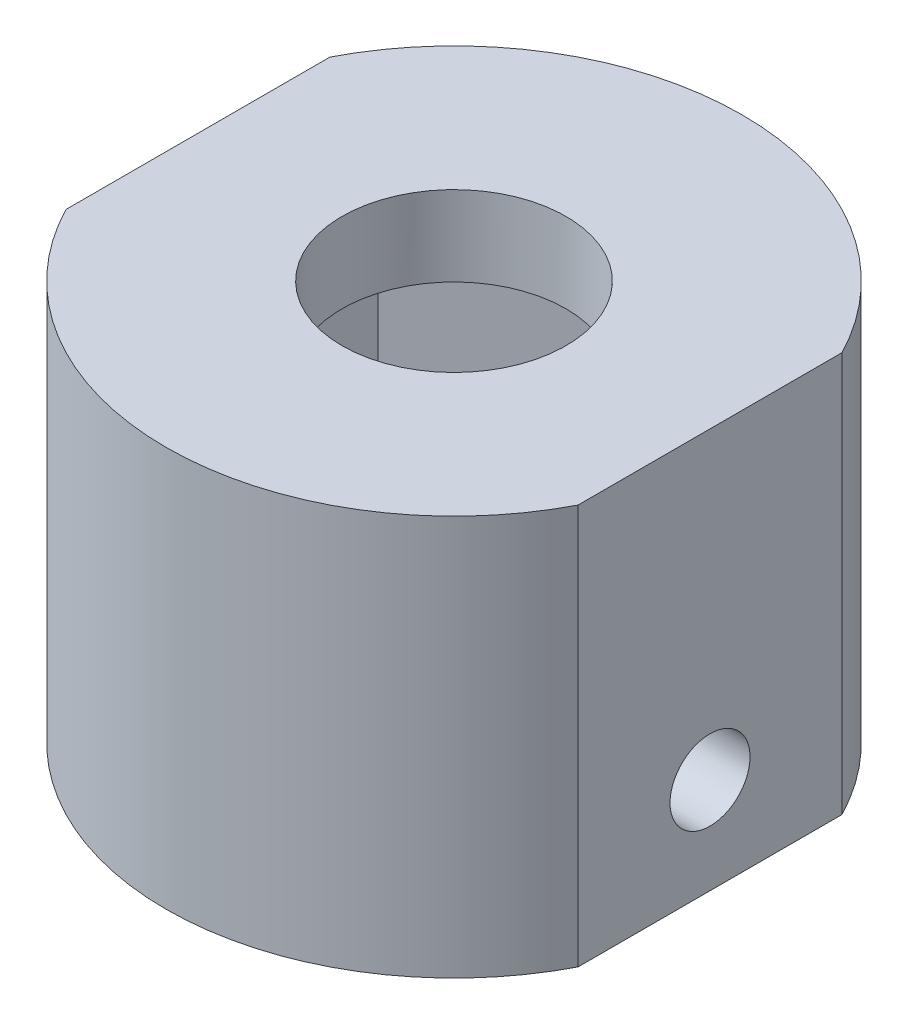
ISO-10303-21;
HEADER;
FILE_DESCRIPTION(('STEP AP214'),'2;1');
FILE_NAME('part.step','',(''),(''),'','','');
FILE_SCHEMA(('AUTOMOTIVE_DESIGN { 1 0 10303 214 1 1 1 1 }'));
ENDSEC;
DATA;
#1=APPLICATION_CONTEXT('core data for automotive mechanical design processes');
#2=APPLICATION_PROTOCOL_DEFINITION('international standard','automotive_design',2000,#1);
#3=PRODUCT_CONTEXT('',#1,'mechanical');
#4=PRODUCT('Part','Part','',(#3));
#5=PRODUCT_RELATED_PRODUCT_CATEGORY('part','',(#4));
#6=PRODUCT_DEFINITION_FORMATION('','',#4);
#7=PRODUCT_DEFINITION_CONTEXT('part definition',#1,'design');
#8=PRODUCT_DEFINITION('design','',#6,#7);
#9=PRODUCT_DEFINITION_SHAPE('','',#8);
#10=(LENGTH_UNIT() NAMED_UNIT(*) SI_UNIT(.MILLI.,.METRE.));
#11=(NAMED_UNIT(*) PLANE_ANGLE_UNIT() SI_UNIT($,.RADIAN.));
#12=(NAMED_UNIT(*) SI_UNIT($,.STERADIAN.) SOLID_ANGLE_UNIT());
#13=UNCERTAINTY_MEASURE_WITH_UNIT(LENGTH_MEASURE(1.E-05),#10,'distance_accuracy_value','');
#14=(GEOMETRIC_REPRESENTATION_CONTEXT(3) GLOBAL_UNCERTAINTY_ASSIGNED_CONTEXT((#13)) GLOBAL_UNIT_ASSIGNED_CONTEXT((#10,
#11,#12)) REPRESENTATION_CONTEXT('',''));
#15=CARTESIAN_POINT('',(0.,0.,0.));
#16=DIRECTION('',(0.,0.,1.));
#17=DIRECTION('',(1.,0.,0.));
#18=AXIS2_PLACEMENT_3D('',#15,#16,#17);
#19=CARTESIAN_POINT('',(0.,12.5,0.));
#20=DIRECTION('',(0.,-1.,0.));
#21=DIRECTION('',(0.,0.,-1.));
#22=AXIS2_PLACEMENT_3D('',#19,#20,#21);
#23=CYLINDRICAL_SURFACE('',#22,9.);
#24=CARTESIAN_POINT('',(0.,12.5,0.));
#25=DIRECTION('',(0.,1.,0.));
#26=DIRECTION('',(0.,0.,1.));
#27=AXIS2_PLACEMENT_3D('',#24,#25,#26);
#28=CIRCLE('',#27,9.);
#29=CARTESIAN_POINT('',(-8.,12.5,4.12310562561766));
#30=VERTEX_POINT('',#29);
#31=CARTESIAN_POINT('',(8.,12.5,4.12310562561766));
#32=VERTEX_POINT('',#31);
#33=EDGE_CURVE('E52',#30,#32,#28,.T.);
#34=ORIENTED_EDGE('',*,*,#33,.F.);
#35=DIRECTION('',(0.,-1.,0.));
#36=VECTOR('',#35,1.);
#37=CARTESIAN_POINT('',(-8.,12.5,4.12310562561766));
#38=LINE('',#37,#36);
#39=CARTESIAN_POINT('',(-8.,0.,4.12310562561766));
#40=VERTEX_POINT('',#39);
#41=EDGE_CURVE('E124',#30,#40,#38,.T.);
#42=ORIENTED_EDGE('',*,*,#41,.T.);
#43=CARTESIAN_POINT('',(0.,0.,0.));
#44=DIRECTION('',(0.,1.,0.));
#45=DIRECTION('',(0.,0.,1.));
#46=AXIS2_PLACEMENT_3D('',#43,#44,#45);
#47=CIRCLE('',#46,9.);
#48=CARTESIAN_POINT('',(8.,0.,4.12310562561766));
#49=VERTEX_POINT('',#48);
#50=EDGE_CURVE('E228',#40,#49,#47,.T.);
#51=ORIENTED_EDGE('',*,*,#50,.T.);
#52=DIRECTION('',(0.,-1.,0.));
#53=VECTOR('',#52,1.);
#54=CARTESIAN_POINT('',(8.,12.5,4.12310562561766));
#55=LINE('',#54,#53);
#56=EDGE_CURVE('E68',#32,#49,#55,.T.);
#57=ORIENTED_EDGE('',*,*,#56,.F.);
#58=EDGE_LOOP('',(#34,#42,#51,#57));
#59=FACE_BOUND('',#58,.T.);
#60=ADVANCED_FACE('F42',(#59),#23,.T.);
#61=CARTESIAN_POINT('',(0.,0.,0.));
#62=DIRECTION('',(0.,1.,0.));
#63=DIRECTION('',(0.,0.,1.));
#64=AXIS2_PLACEMENT_3D('',#61,#62,#63);
#65=CYLINDRICAL_SURFACE('',#64,3.5);
#66=CARTESIAN_POINT('',(0.,12.5,0.));
#67=DIRECTION('',(0.,1.,0.));
#68=DIRECTION('',(0.,0.,1.));
#69=AXIS2_PLACEMENT_3D('',#66,#67,#68);
#70=CIRCLE('',#69,3.5);
#71=CARTESIAN_POINT('',(0.,12.5,3.5));
#72=VERTEX_POINT('',#71);
#73=EDGE_CURVE('E225',#72,#72,#70,.T.);
#74=ORIENTED_EDGE('',*,*,#73,.T.);
#75=EDGE_LOOP('',(#74));
#76=FACE_BOUND('',#75,.T.);
#77=CARTESIAN_POINT('',(0.,10.,0.));
#78=DIRECTION('',(0.,-1.,0.));
#79=DIRECTION('',(0.,0.,-1.));
#80=AXIS2_PLACEMENT_3D('',#77,#78,#79);
#81=CIRCLE('',#80,3.5);
#82=CARTESIAN_POINT('',(0.,10.,-3.5));
#83=VERTEX_POINT('',#82);
#84=EDGE_CURVE('E209',#83,#83,#81,.F.);
#85=ORIENTED_EDGE('',*,*,#84,.F.);
#86=EDGE_LOOP('',(#85));
#87=FACE_BOUND('',#86,.T.);
#88=ADVANCED_FACE('F257',(#76,#87),#65,.F.);
#89=CARTESIAN_POINT('',(8.,0.,-4.12310562561766));
#90=VERTEX_POINT('',#89);
#91=CARTESIAN_POINT('',(-8.,0.,-4.12310562561766));
#92=VERTEX_POINT('',#91);
#93=EDGE_CURVE('E136',#90,#92,#47,.T.);
#94=ORIENTED_EDGE('',*,*,#93,.T.);
#95=DIRECTION('',(0.,-1.,0.));
#96=VECTOR('',#95,1.);
#97=CARTESIAN_POINT('',(-8.,12.5,-4.12310562561766));
#98=LINE('',#97,#96);
#99=CARTESIAN_POINT('',(-8.,12.5,-4.12310562561766));
#100=VERTEX_POINT('',#99);
#101=EDGE_CURVE('E60',#100,#92,#98,.T.);
#102=ORIENTED_EDGE('',*,*,#101,.F.);
#103=CARTESIAN_POINT('',(8.,12.5,-4.12310562561766));
#104=VERTEX_POINT('',#103);
#105=EDGE_CURVE('E11',#104,#100,#28,.T.);
#106=ORIENTED_EDGE('',*,*,#105,.F.);
#107=DIRECTION('',(0.,-1.,0.));
#108=VECTOR('',#107,1.);
#109=CARTESIAN_POINT('',(8.,12.5,-4.12310562561766));
#110=LINE('',#109,#108);
#111=EDGE_CURVE('E149',#104,#90,#110,.T.);
#112=ORIENTED_EDGE('',*,*,#111,.T.);
#113=EDGE_LOOP('',(#94,#102,#106,#112));
#114=FACE_BOUND('',#113,.T.);
#115=ADVANCED_FACE('F44',(#114),#23,.T.);
#116=CARTESIAN_POINT('',(0.,12.5,0.));
#117=DIRECTION('',(0.,1.,0.));
#118=DIRECTION('',(0.,0.,1.));
#119=AXIS2_PLACEMENT_3D('',#116,#117,#118);
#120=PLANE('',#119);
#121=DIRECTION('',(0.,0.,1.));
#122=VECTOR('',#121,1.);
#123=CARTESIAN_POINT('',(-8.,12.5,4.12310562561766));
#124=LINE('',#123,#122);
#125=EDGE_CURVE('E120',#100,#30,#124,.T.);
#126=ORIENTED_EDGE('',*,*,#125,.T.);
#127=ORIENTED_EDGE('',*,*,#33,.T.);
#128=DIRECTION('',(0.,0.,-1.));
#129=VECTOR('',#128,1.);
#130=CARTESIAN_POINT('',(8.,12.5,4.12310562561766));
#131=LINE('',#130,#129);
#132=EDGE_CURVE('E142',#32,#104,#131,.T.);
#133=ORIENTED_EDGE('',*,*,#132,.T.);
#134=ORIENTED_EDGE('',*,*,#105,.T.);
#135=EDGE_LOOP('',(#126,#127,#133,#134));
#136=FACE_BOUND('',#135,.T.);
#137=ORIENTED_EDGE('',*,*,#73,.F.);
#138=EDGE_LOOP('',(#137));
#139=FACE_BOUND('',#138,.T.);
#140=ADVANCED_FACE('F140',(#136,#139),#120,.T.);
#141=CARTESIAN_POINT('',(0.,0.,0.));
#142=DIRECTION('',(0.,1.,0.));
#143=DIRECTION('',(0.,0.,1.));
#144=AXIS2_PLACEMENT_3D('',#141,#142,#143);
#145=PLANE('',#144);
#146=DIRECTION('',(-0.866025403784439,0.,-0.5));
#147=VECTOR('',#146,1.);
#148=CARTESIAN_POINT('',(0.,0.,6.49519052838329));
#149=LINE('',#148,#147);
#150=CARTESIAN_POINT('',(0.,0.,6.49519052838329));
#151=VERTEX_POINT('',#150);
#152=CARTESIAN_POINT('',(-5.625,0.,3.24759526419164));
#153=VERTEX_POINT('',#152);
#154=EDGE_CURVE('E187',#151,#153,#149,.T.);
#155=ORIENTED_EDGE('',*,*,#154,.F.);
#156=DIRECTION('',(-0.866025403784439,0.,0.5));
#157=VECTOR('',#156,1.);
#158=CARTESIAN_POINT('',(5.625,0.,3.24759526419165));
#159=LINE('',#158,#157);
#160=CARTESIAN_POINT('',(5.625,0.,3.24759526419165));
#161=VERTEX_POINT('',#160);
#162=EDGE_CURVE('E157',#161,#151,#159,.T.);
#163=ORIENTED_EDGE('',*,*,#162,.F.);
#164=DIRECTION('',(0.,0.,1.));
#165=VECTOR('',#164,1.);
#166=CARTESIAN_POINT('',(5.625,0.,-3.24759526419164));
#167=LINE('',#166,#165);
#168=CARTESIAN_POINT('',(5.625,0.,-3.24759526419164));
#169=VERTEX_POINT('',#168);
#170=EDGE_CURVE('E164',#169,#161,#167,.T.);
#171=ORIENTED_EDGE('',*,*,#170,.F.);
#172=DIRECTION('',(0.866025403784439,0.,0.5));
#173=VECTOR('',#172,1.);
#174=CARTESIAN_POINT('',(0.,0.,-6.49519052838329));
#175=LINE('',#174,#173);
#176=CARTESIAN_POINT('',(0.,0.,-6.49519052838329));
#177=VERTEX_POINT('',#176);
#178=EDGE_CURVE('E199',#177,#169,#175,.T.);
#179=ORIENTED_EDGE('',*,*,#178,.F.);
#180=DIRECTION('',(0.866025403784439,0.,-0.5));
#181=VECTOR('',#180,1.);
#182=CARTESIAN_POINT('',(-5.625,0.,-3.24759526419165));
#183=LINE('',#182,#181);
#184=CARTESIAN_POINT('',(-5.625,0.,-3.24759526419165));
#185=VERTEX_POINT('',#184);
#186=EDGE_CURVE('E195',#185,#177,#183,.T.);
#187=ORIENTED_EDGE('',*,*,#186,.F.);
#188=DIRECTION('',(0.,0.,-1.));
#189=VECTOR('',#188,1.);
#190=CARTESIAN_POINT('',(-5.625,0.,3.24759526419164));
#191=LINE('',#190,#189);
#192=EDGE_CURVE('E191',#153,#185,#191,.T.);
#193=ORIENTED_EDGE('',*,*,#192,.F.);
#194=EDGE_LOOP('',(#155,#163,#171,#179,#187,#193));
#195=FACE_BOUND('',#194,.T.);
#196=ORIENTED_EDGE('',*,*,#50,.F.);
#197=DIRECTION('',(0.,0.,1.));
#198=VECTOR('',#197,1.);
#199=CARTESIAN_POINT('',(-8.,0.,4.12310562561766));
#200=LINE('',#199,#198);
#201=EDGE_CURVE('E129',#92,#40,#200,.T.);
#202=ORIENTED_EDGE('',*,*,#201,.F.);
#203=ORIENTED_EDGE('',*,*,#93,.F.);
#204=DIRECTION('',(0.,0.,-1.));
#205=VECTOR('',#204,1.);
#206=CARTESIAN_POINT('',(8.,0.,4.12310562561766));
#207=LINE('',#206,#205);
#208=EDGE_CURVE('E144',#49,#90,#207,.T.);
#209=ORIENTED_EDGE('',*,*,#208,.F.);
#210=EDGE_LOOP('',(#196,#202,#203,#209));
#211=FACE_BOUND('',#210,.T.);
#212=ADVANCED_FACE('F253',(#195,#211),#145,.F.);
#213=CARTESIAN_POINT('',(0.,10.,0.));
#214=DIRECTION('',(0.,-1.,0.));
#215=DIRECTION('',(0.,0.,-1.));
#216=AXIS2_PLACEMENT_3D('',#213,#214,#215);
#217=PLANE('',#216);
#218=DIRECTION('',(-0.866025403784439,0.,0.5));
#219=VECTOR('',#218,1.);
#220=CARTESIAN_POINT('',(5.625,10.,3.24759526419165));
#221=LINE('',#220,#219);
#222=CARTESIAN_POINT('',(5.625,10.,3.24759526419165));
#223=VERTEX_POINT('',#222);
#224=CARTESIAN_POINT('',(0.,10.,6.49519052838329));
#225=VERTEX_POINT('',#224);
#226=EDGE_CURVE('E159',#223,#225,#221,.T.);
#227=ORIENTED_EDGE('',*,*,#226,.T.);
#228=DIRECTION('',(-0.866025403784439,0.,-0.5));
#229=VECTOR('',#228,1.);
#230=CARTESIAN_POINT('',(0.,10.,6.49519052838329));
#231=LINE('',#230,#229);
#232=CARTESIAN_POINT('',(-5.625,10.,3.24759526419164));
#233=VERTEX_POINT('',#232);
#234=EDGE_CURVE('E163',#225,#233,#231,.T.);
#235=ORIENTED_EDGE('',*,*,#234,.T.);
#236=DIRECTION('',(0.,0.,-1.));
#237=VECTOR('',#236,1.);
#238=CARTESIAN_POINT('',(-5.625,10.,3.24759526419164));
#239=LINE('',#238,#237);
#240=CARTESIAN_POINT('',(-5.625,10.,-3.24759526419165));
#241=VERTEX_POINT('',#240);
#242=EDGE_CURVE('E168',#233,#241,#239,.T.);
#243=ORIENTED_EDGE('',*,*,#242,.T.);
#244=DIRECTION('',(0.866025403784439,0.,-0.5));
#245=VECTOR('',#244,1.);
#246=CARTESIAN_POINT('',(-5.625,10.,-3.24759526419165));
#247=LINE('',#246,#245);
#248=CARTESIAN_POINT('',(0.,10.,-6.49519052838329));
#249=VERTEX_POINT('',#248);
#250=EDGE_CURVE('E172',#241,#249,#247,.T.);
#251=ORIENTED_EDGE('',*,*,#250,.T.);
#252=DIRECTION('',(0.866025403784439,0.,0.5));
#253=VECTOR('',#252,1.);
#254=CARTESIAN_POINT('',(0.,10.,-6.49519052838329));
#255=LINE('',#254,#253);
#256=CARTESIAN_POINT('',(5.625,10.,-3.24759526419164));
#257=VERTEX_POINT('',#256);
#258=EDGE_CURVE('E176',#249,#257,#255,.T.);
#259=ORIENTED_EDGE('',*,*,#258,.T.);
#260=DIRECTION('',(0.,0.,1.));
#261=VECTOR('',#260,1.);
#262=CARTESIAN_POINT('',(5.625,10.,-3.24759526419164));
#263=LINE('',#262,#261);
#264=EDGE_CURVE('E180',#257,#223,#263,.T.);
#265=ORIENTED_EDGE('',*,*,#264,.T.);
#266=EDGE_LOOP('',(#227,#235,#243,#251,#259,#265));
#267=FACE_BOUND('',#266,.T.);
#268=ORIENTED_EDGE('',*,*,#84,.T.);
#269=EDGE_LOOP('',(#268));
#270=FACE_BOUND('',#269,.T.);
#271=ADVANCED_FACE('F272',(#267,#270),#217,.T.);
#272=CARTESIAN_POINT('',(5.625,10.,3.24759526419165));
#273=DIRECTION('',(0.5,0.,0.866025403784439));
#274=DIRECTION('',(0.866025403784439,0.,-0.5));
#275=AXIS2_PLACEMENT_3D('',#272,#273,#274);
#276=PLANE('',#275);
#277=ORIENTED_EDGE('',*,*,#162,.T.);
#278=DIRECTION('',(0.,-1.,0.));
#279=VECTOR('',#278,1.);
#280=CARTESIAN_POINT('',(0.,10.,6.49519052838329));
#281=LINE('',#280,#279);
#282=EDGE_CURVE('E184',#225,#151,#281,.T.);
#283=ORIENTED_EDGE('',*,*,#282,.F.);
#284=ORIENTED_EDGE('',*,*,#226,.F.);
#285=DIRECTION('',(0.,-1.,0.));
#286=VECTOR('',#285,1.);
#287=CARTESIAN_POINT('',(5.625,10.,3.24759526419165));
#288=LINE('',#287,#286);
#289=EDGE_CURVE('E206',#223,#161,#288,.T.);
#290=ORIENTED_EDGE('',*,*,#289,.T.);
#291=EDGE_LOOP('',(#277,#283,#284,#290));
#292=FACE_BOUND('',#291,.T.);
#293=ADVANCED_FACE('F275',(#292),#276,.F.);
#294=CARTESIAN_POINT('',(5.625,10.,-3.24759526419164));
#295=DIRECTION('',(1.,0.,0.));
#296=DIRECTION('',(0.,0.,-1.));
#297=AXIS2_PLACEMENT_3D('',#294,#295,#296);
#298=PLANE('',#297);
#299=CARTESIAN_POINT('',(5.625,3.,0.));
#300=DIRECTION('',(1.,0.,0.));
#301=DIRECTION('',(0.,0.,-1.));
#302=AXIS2_PLACEMENT_3D('',#299,#300,#301);
#303=CIRCLE('',#302,1.25);
#304=CARTESIAN_POINT('',(5.625,3.,-1.25));
#305=VERTEX_POINT('',#304);
#306=EDGE_CURVE('E153',#305,#305,#303,.T.);
#307=ORIENTED_EDGE('',*,*,#306,.T.);
#308=EDGE_LOOP('',(#307));
#309=FACE_BOUND('',#308,.T.);
#310=ORIENTED_EDGE('',*,*,#170,.T.);
#311=ORIENTED_EDGE('',*,*,#289,.F.);
#312=ORIENTED_EDGE('',*,*,#264,.F.);
#313=DIRECTION('',(0.,-1.,0.));
#314=VECTOR('',#313,1.);
#315=CARTESIAN_POINT('',(5.625,10.,-3.24759526419164));
#316=LINE('',#315,#314);
#317=EDGE_CURVE('E210',#257,#169,#316,.T.);
#318=ORIENTED_EDGE('',*,*,#317,.T.);
#319=EDGE_LOOP('',(#310,#311,#312,#318));
#320=FACE_BOUND('',#319,.T.);
#321=ADVANCED_FACE('F278',(#309,#320),#298,.F.);
#322=CARTESIAN_POINT('',(0.,10.,-6.49519052838329));
#323=DIRECTION('',(0.5,0.,-0.866025403784439));
#324=DIRECTION('',(-0.866025403784439,0.,-0.5));
#325=AXIS2_PLACEMENT_3D('',#322,#323,#324);
#326=PLANE('',#325);
#327=ORIENTED_EDGE('',*,*,#178,.T.);
#328=ORIENTED_EDGE('',*,*,#317,.F.);
#329=ORIENTED_EDGE('',*,*,#258,.F.);
#330=DIRECTION('',(0.,-1.,0.));
#331=VECTOR('',#330,1.);
#332=CARTESIAN_POINT('',(0.,10.,-6.49519052838329));
#333=LINE('',#332,#331);
#334=EDGE_CURVE('E213',#249,#177,#333,.T.);
#335=ORIENTED_EDGE('',*,*,#334,.T.);
#336=EDGE_LOOP('',(#327,#328,#329,#335));
#337=FACE_BOUND('',#336,.T.);
#338=ADVANCED_FACE('F291',(#337),#326,.F.);
#339=CARTESIAN_POINT('',(-5.625,10.,-3.24759526419165));
#340=DIRECTION('',(-0.5,0.,-0.866025403784439));
#341=DIRECTION('',(-0.866025403784439,0.,0.5));
#342=AXIS2_PLACEMENT_3D('',#339,#340,#341);
#343=PLANE('',#342);
#344=ORIENTED_EDGE('',*,*,#186,.T.);
#345=ORIENTED_EDGE('',*,*,#334,.F.);
#346=ORIENTED_EDGE('',*,*,#250,.F.);
#347=DIRECTION('',(0.,-1.,0.));
#348=VECTOR('',#347,1.);
#349=CARTESIAN_POINT('',(-5.625,10.,-3.24759526419165));
#350=LINE('',#349,#348);
#351=EDGE_CURVE('E216',#241,#185,#350,.T.);
#352=ORIENTED_EDGE('',*,*,#351,.T.);
#353=EDGE_LOOP('',(#344,#345,#346,#352));
#354=FACE_BOUND('',#353,.T.);
#355=ADVANCED_FACE('F287',(#354),#343,.F.);
#356=CARTESIAN_POINT('',(-5.625,10.,3.24759526419164));
#357=DIRECTION('',(-1.,0.,0.));
#358=DIRECTION('',(0.,0.,1.));
#359=AXIS2_PLACEMENT_3D('',#356,#357,#358);
#360=PLANE('',#359);
#361=CARTESIAN_POINT('',(-5.625,3.,0.));
#362=DIRECTION('',(-1.,0.,0.));
#363=DIRECTION('',(0.,0.,1.));
#364=AXIS2_PLACEMENT_3D('',#361,#362,#363);
#365=CIRCLE('',#364,1.25);
#366=CARTESIAN_POINT('',(-5.625,3.,1.25));
#367=VERTEX_POINT('',#366);
#368=EDGE_CURVE('E158',#367,#367,#365,.T.);
#369=ORIENTED_EDGE('',*,*,#368,.T.);
#370=EDGE_LOOP('',(#369));
#371=FACE_BOUND('',#370,.T.);
#372=ORIENTED_EDGE('',*,*,#192,.T.);
#373=ORIENTED_EDGE('',*,*,#351,.F.);
#374=ORIENTED_EDGE('',*,*,#242,.F.);
#375=DIRECTION('',(0.,-1.,0.));
#376=VECTOR('',#375,1.);
#377=CARTESIAN_POINT('',(-5.625,10.,3.24759526419164));
#378=LINE('',#377,#376);
#379=EDGE_CURVE('E219',#233,#153,#378,.T.);
#380=ORIENTED_EDGE('',*,*,#379,.T.);
#381=EDGE_LOOP('',(#372,#373,#374,#380));
#382=FACE_BOUND('',#381,.T.);
#383=ADVANCED_FACE('F284',(#371,#382),#360,.F.);
#384=CARTESIAN_POINT('',(0.,10.,6.49519052838329));
#385=DIRECTION('',(-0.5,0.,0.866025403784438));
#386=DIRECTION('',(0.866025403784439,0.,0.5));
#387=AXIS2_PLACEMENT_3D('',#384,#385,#386);
#388=PLANE('',#387);
#389=ORIENTED_EDGE('',*,*,#154,.T.);
#390=ORIENTED_EDGE('',*,*,#379,.F.);
#391=ORIENTED_EDGE('',*,*,#234,.F.);
#392=ORIENTED_EDGE('',*,*,#282,.T.);
#393=EDGE_LOOP('',(#389,#390,#391,#392));
#394=FACE_BOUND('',#393,.T.);
#395=ADVANCED_FACE('F280',(#394),#388,.F.);
#396=CARTESIAN_POINT('',(-9.,3.,0.));
#397=DIRECTION('',(1.,0.,0.));
#398=DIRECTION('',(0.,0.,-1.));
#399=AXIS2_PLACEMENT_3D('',#396,#397,#398);
#400=CYLINDRICAL_SURFACE('',#399,1.25);
#401=CARTESIAN_POINT('',(-8.,3.,0.));
#402=DIRECTION('',(1.,0.,0.));
#403=DIRECTION('',(0.,0.,-1.));
#404=AXIS2_PLACEMENT_3D('',#401,#402,#403);
#405=CIRCLE('',#404,1.25);
#406=CARTESIAN_POINT('',(-8.,3.,-1.25));
#407=VERTEX_POINT('',#406);
#408=EDGE_CURVE('E46',#407,#407,#405,.F.);
#409=ORIENTED_EDGE('',*,*,#408,.T.);
#410=EDGE_LOOP('',(#409));
#411=FACE_BOUND('',#410,.T.);
#412=ORIENTED_EDGE('',*,*,#368,.F.);
#413=EDGE_LOOP('',(#412));
#414=FACE_BOUND('',#413,.T.);
#415=ADVANCED_FACE('F283',(#411,#414),#400,.F.);
#416=CARTESIAN_POINT('',(8.00000000000001,3.,0.));
#417=DIRECTION('',(-1.,0.,0.));
#418=DIRECTION('',(0.,0.,1.));
#419=AXIS2_PLACEMENT_3D('',#416,#417,#418);
#420=CIRCLE('',#419,1.25);
#421=CARTESIAN_POINT('',(8.00000000000001,3.,1.25));
#422=VERTEX_POINT('',#421);
#423=EDGE_CURVE('E239',#422,#422,#420,.F.);
#424=ORIENTED_EDGE('',*,*,#423,.T.);
#425=EDGE_LOOP('',(#424));
#426=FACE_BOUND('',#425,.T.);
#427=ORIENTED_EDGE('',*,*,#306,.F.);
#428=EDGE_LOOP('',(#427));
#429=FACE_BOUND('',#428,.T.);
#430=ADVANCED_FACE('F304',(#426,#429),#400,.F.);
#431=CARTESIAN_POINT('',(8.,12.5,4.12310562561766));
#432=DIRECTION('',(-1.,0.,0.));
#433=DIRECTION('',(0.,0.,1.));
#434=AXIS2_PLACEMENT_3D('',#431,#432,#433);
#435=PLANE('',#434);
#436=ORIENTED_EDGE('',*,*,#208,.T.);
#437=ORIENTED_EDGE('',*,*,#111,.F.);
#438=ORIENTED_EDGE('',*,*,#132,.F.);
#439=ORIENTED_EDGE('',*,*,#56,.T.);
#440=EDGE_LOOP('',(#436,#437,#438,#439));
#441=FACE_BOUND('',#440,.T.);
#442=ORIENTED_EDGE('',*,*,#423,.F.);
#443=EDGE_LOOP('',(#442));
#444=FACE_BOUND('',#443,.T.);
#445=ADVANCED_FACE('F306',(#441,#444),#435,.F.);
#446=CARTESIAN_POINT('',(-8.,12.5,4.12310562561766));
#447=DIRECTION('',(1.,0.,0.));
#448=DIRECTION('',(0.,0.,-1.));
#449=AXIS2_PLACEMENT_3D('',#446,#447,#448);
#450=PLANE('',#449);
#451=ORIENTED_EDGE('',*,*,#201,.T.);
#452=ORIENTED_EDGE('',*,*,#41,.F.);
#453=ORIENTED_EDGE('',*,*,#125,.F.);
#454=ORIENTED_EDGE('',*,*,#101,.T.);
#455=EDGE_LOOP('',(#451,#452,#453,#454));
#456=FACE_BOUND('',#455,.T.);
#457=ORIENTED_EDGE('',*,*,#408,.F.);
#458=EDGE_LOOP('',(#457));
#459=FACE_BOUND('',#458,.T.);
#460=ADVANCED_FACE('F121',(#456,#459),#450,.F.);
#461=CLOSED_SHELL('',(#60,#88,#115,#140,#212,#271,#293,#321,#338,#355,#383,#395,#415,#430,#445,#460));
#462=MANIFOLD_SOLID_BREP('B2',#461);
#463=ADVANCED_BREP_SHAPE_REPRESENTATION('',(#18,#462),#14);
#464=SHAPE_DEFINITION_REPRESENTATION(#9,#463);
ENDSEC;
END-ISO-10303-21;
